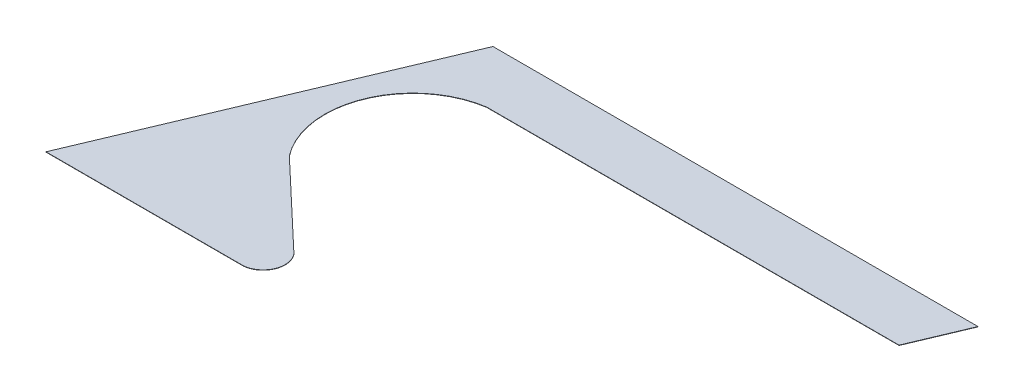
ISO-10303-21;
HEADER;
FILE_DESCRIPTION(('STEP AP214'),'2;1');
FILE_NAME('part.step','',(''),(''),'','','');
FILE_SCHEMA(('AUTOMOTIVE_DESIGN { 1 0 10303 214 1 1 1 1 }'));
ENDSEC;
DATA;
#1=APPLICATION_CONTEXT('core data for automotive mechanical design processes');
#2=APPLICATION_PROTOCOL_DEFINITION('international standard','automotive_design',2000,#1);
#3=PRODUCT_CONTEXT('',#1,'mechanical');
#4=PRODUCT('Part','Part','',(#3));
#5=PRODUCT_RELATED_PRODUCT_CATEGORY('part','',(#4));
#6=PRODUCT_DEFINITION_FORMATION('','',#4);
#7=PRODUCT_DEFINITION_CONTEXT('part definition',#1,'design');
#8=PRODUCT_DEFINITION('design','',#6,#7);
#9=PRODUCT_DEFINITION_SHAPE('','',#8);
#10=(LENGTH_UNIT() NAMED_UNIT(*) SI_UNIT(.MILLI.,.METRE.));
#11=(NAMED_UNIT(*) PLANE_ANGLE_UNIT() SI_UNIT($,.RADIAN.));
#12=(NAMED_UNIT(*) SI_UNIT($,.STERADIAN.) SOLID_ANGLE_UNIT());
#13=UNCERTAINTY_MEASURE_WITH_UNIT(LENGTH_MEASURE(1.E-05),#10,'distance_accuracy_value','');
#14=(GEOMETRIC_REPRESENTATION_CONTEXT(3) GLOBAL_UNCERTAINTY_ASSIGNED_CONTEXT((#13)) GLOBAL_UNIT_ASSIGNED_CONTEXT((#10,
#11,#12)) REPRESENTATION_CONTEXT('',''));
#15=CARTESIAN_POINT('',(0.,0.,0.));
#16=DIRECTION('',(0.,0.,1.));
#17=DIRECTION('',(1.,0.,0.));
#18=AXIS2_PLACEMENT_3D('',#15,#16,#17);
#19=CARTESIAN_POINT('',(2.42898250182353,1.4,-0.604428219022611));
#20=DIRECTION('',(0.,1.,0.));
#21=DIRECTION('',(0.,0.,1.));
#22=AXIS2_PLACEMENT_3D('',#19,#20,#21);
#23=PLANE('',#22);
#24=DIRECTION('',(1.,0.,0.));
#25=VECTOR('',#24,1.);
#26=CARTESIAN_POINT('',(2.22201824333883,1.4,-1.5656722541407));
#27=LINE('',#26,#25);
#28=CARTESIAN_POINT('',(2.22201824333883,1.4,-1.5656722541407));
#29=VERTEX_POINT('',#28);
#30=CARTESIAN_POINT('',(3.81387134230726,1.4,-1.5656722541407));
#31=VERTEX_POINT('',#30);
#32=EDGE_CURVE('E108',#29,#31,#27,.T.);
#33=ORIENTED_EDGE('',*,*,#32,.T.);
#34=DIRECTION('',(-0.38758863936305,0.,0.921832439566269));
#35=VECTOR('',#34,1.);
#36=CARTESIAN_POINT('',(3.81387134230726,1.4,-1.5656722541407));
#37=LINE('',#36,#35);
#38=CARTESIAN_POINT('',(3.73718050290381,1.4,-1.38327241988384));
#39=VERTEX_POINT('',#38);
#40=EDGE_CURVE('E113',#31,#39,#37,.T.);
#41=ORIENTED_EDGE('',*,*,#40,.T.);
#42=DIRECTION('',(-1.,0.,0.));
#43=VECTOR('',#42,1.);
#44=CARTESIAN_POINT('',(3.73718050290381,1.4,-1.38327241988384));
#45=LINE('',#44,#43);
#46=CARTESIAN_POINT('',(2.3836908237028,1.4,-1.38327241988385));
#47=VERTEX_POINT('',#46);
#48=EDGE_CURVE('E117',#39,#47,#45,.T.);
#49=ORIENTED_EDGE('',*,*,#48,.T.);
#50=CARTESIAN_POINT('',(2.42747650234616,1.4,-1.09742714252926));
#51=DIRECTION('',(0.,-1.,0.));
#52=DIRECTION('',(0.,0.,-1.));
#53=AXIS2_PLACEMENT_3D('',#50,#51,#52);
#54=CIRCLE('',#53,0.28917937035719);
#55=CARTESIAN_POINT('',(2.19848355236835,1.4,-0.920828906126266));
#56=VERTEX_POINT('',#55);
#57=EDGE_CURVE('E135',#47,#56,#54,.F.);
#58=ORIENTED_EDGE('',*,*,#57,.T.);
#59=DIRECTION('',(0.725985572382732,0.,0.687709930633633));
#60=VECTOR('',#59,1.);
#61=CARTESIAN_POINT('',(2.19848355236831,1.4,-0.920828906126307));
#62=LINE('',#61,#60);
#63=CARTESIAN_POINT('',(2.48512110337624,1.4,-0.649303551051155));
#64=VERTEX_POINT('',#63);
#65=EDGE_CURVE('E121',#56,#64,#62,.T.);
#66=ORIENTED_EDGE('',*,*,#65,.T.);
#67=CARTESIAN_POINT('',(2.42898250182353,1.4,-0.604428219022611));
#68=DIRECTION('',(0.,-1.,0.));
#69=DIRECTION('',(0.,0.,-1.));
#70=AXIS2_PLACEMENT_3D('',#67,#68,#69);
#71=CIRCLE('',#70,0.0718702859947409);
#72=CARTESIAN_POINT('',(2.43618709117142,1.4,-0.53291995445624));
#73=VERTEX_POINT('',#72);
#74=EDGE_CURVE('E90',#73,#64,#71,.F.);
#75=ORIENTED_EDGE('',*,*,#74,.F.);
#76=DIRECTION('',(-1.,0.,0.));
#77=VECTOR('',#76,1.);
#78=CARTESIAN_POINT('',(1.78779284460792,1.4,-0.532919954456243));
#79=LINE('',#78,#77);
#80=CARTESIAN_POINT('',(1.78779284460791,1.4,-0.532919954456245));
#81=VERTEX_POINT('',#80);
#82=EDGE_CURVE('E88',#73,#81,#79,.T.);
#83=ORIENTED_EDGE('',*,*,#82,.T.);
#84=DIRECTION('',(0.38758863936305,0.,-0.921832439566269));
#85=VECTOR('',#84,1.);
#86=CARTESIAN_POINT('',(2.22201824333883,1.4,-1.5656722541407));
#87=LINE('',#86,#85);
#88=EDGE_CURVE('E74',#81,#29,#87,.T.);
#89=ORIENTED_EDGE('',*,*,#88,.T.);
#90=EDGE_LOOP('',(#33,#41,#49,#58,#66,#75,#83,#89));
#91=FACE_BOUND('',#90,.T.);
#92=ADVANCED_FACE('F16',(#91),#23,.F.);
#93=CARTESIAN_POINT('',(2.22201824333883,1.401,-1.5656722541407));
#94=DIRECTION('',(0.921832439566269,0.,0.38758863936305));
#95=DIRECTION('',(0.38758863936305,0.,-0.921832439566269));
#96=AXIS2_PLACEMENT_3D('',#93,#94,#95);
#97=PLANE('',#96);
#98=DIRECTION('',(0.,1.,0.));
#99=VECTOR('',#98,1.);
#100=CARTESIAN_POINT('',(1.78779284460791,1.401,-0.532919954456246));
#101=LINE('',#100,#99);
#102=CARTESIAN_POINT('',(1.78779284460792,1.401,-0.532919954456244));
#103=VERTEX_POINT('',#102);
#104=EDGE_CURVE('E19',#81,#103,#101,.T.);
#105=ORIENTED_EDGE('',*,*,#104,.T.);
#106=DIRECTION('',(-0.387588639363042,0.,0.921832439566273));
#107=VECTOR('',#106,1.);
#108=CARTESIAN_POINT('',(2.22201824333883,1.401,-1.5656722541407));
#109=LINE('',#108,#107);
#110=CARTESIAN_POINT('',(2.22201824333883,1.401,-1.5656722541407));
#111=VERTEX_POINT('',#110);
#112=EDGE_CURVE('E104',#111,#103,#109,.T.);
#113=ORIENTED_EDGE('',*,*,#112,.F.);
#114=DIRECTION('',(0.,1.,0.));
#115=VECTOR('',#114,1.);
#116=CARTESIAN_POINT('',(2.22201824333883,1.401,-1.5656722541407));
#117=LINE('',#116,#115);
#118=EDGE_CURVE('E82',#111,#29,#117,.F.);
#119=ORIENTED_EDGE('',*,*,#118,.T.);
#120=ORIENTED_EDGE('',*,*,#88,.F.);
#121=EDGE_LOOP('',(#105,#113,#119,#120));
#122=FACE_BOUND('',#121,.T.);
#123=ADVANCED_FACE('F76',(#122),#97,.F.);
#124=CARTESIAN_POINT('',(1.78779284460792,1.401,-0.532919954456243));
#125=DIRECTION('',(0.,0.,-1.));
#126=DIRECTION('',(-1.,0.,0.));
#127=AXIS2_PLACEMENT_3D('',#124,#125,#126);
#128=PLANE('',#127);
#129=DIRECTION('',(0.,-1.,0.));
#130=VECTOR('',#129,1.);
#131=CARTESIAN_POINT('',(2.43618709117138,1.401,-0.532919954456236));
#132=LINE('',#131,#130);
#133=CARTESIAN_POINT('',(2.43618709117142,1.401,-0.53291995445624));
#134=VERTEX_POINT('',#133);
#135=EDGE_CURVE('E98',#134,#73,#132,.T.);
#136=ORIENTED_EDGE('',*,*,#135,.F.);
#137=DIRECTION('',(1.,0.,0.));
#138=VECTOR('',#137,1.);
#139=CARTESIAN_POINT('',(2.42898250182353,1.401,-0.532919954456243));
#140=LINE('',#139,#138);
#141=EDGE_CURVE('E96',#103,#134,#140,.T.);
#142=ORIENTED_EDGE('',*,*,#141,.F.);
#143=ORIENTED_EDGE('',*,*,#104,.F.);
#144=ORIENTED_EDGE('',*,*,#82,.F.);
#145=EDGE_LOOP('',(#136,#142,#143,#144));
#146=FACE_BOUND('',#145,.T.);
#147=ADVANCED_FACE('F94',(#146),#128,.F.);
#148=CARTESIAN_POINT('',(2.42898250182353,1.401,-0.604428219022611));
#149=DIRECTION('',(0.,-1.,0.));
#150=DIRECTION('',(0.,0.,-1.));
#151=AXIS2_PLACEMENT_3D('',#148,#149,#150);
#152=CYLINDRICAL_SURFACE('',#151,0.0718702859947409);
#153=CARTESIAN_POINT('',(2.42898250182353,1.401,-0.604428219022611));
#154=DIRECTION('',(0.,-1.,0.));
#155=DIRECTION('',(0.,0.,-1.));
#156=AXIS2_PLACEMENT_3D('',#153,#154,#155);
#157=CIRCLE('',#156,0.0718702859947409);
#158=CARTESIAN_POINT('',(2.48512110337624,1.401,-0.649303551051151));
#159=VERTEX_POINT('',#158);
#160=EDGE_CURVE('E103',#134,#159,#157,.F.);
#161=ORIENTED_EDGE('',*,*,#160,.F.);
#162=ORIENTED_EDGE('',*,*,#135,.T.);
#163=ORIENTED_EDGE('',*,*,#74,.T.);
#164=DIRECTION('',(0.,-1.,0.));
#165=VECTOR('',#164,1.);
#166=CARTESIAN_POINT('',(2.48512110337625,1.401,-0.649303551051143));
#167=LINE('',#166,#165);
#168=EDGE_CURVE('E123',#64,#159,#167,.F.);
#169=ORIENTED_EDGE('',*,*,#168,.T.);
#170=EDGE_LOOP('',(#161,#162,#163,#169));
#171=FACE_BOUND('',#170,.T.);
#172=ADVANCED_FACE('F141',(#171),#152,.T.);
#173=CARTESIAN_POINT('',(2.19848355236831,1.401,-0.920828906126307));
#174=DIRECTION('',(-0.687709930633633,0.,0.725985572382732));
#175=DIRECTION('',(0.725985572382732,0.,0.687709930633633));
#176=AXIS2_PLACEMENT_3D('',#173,#174,#175);
#177=PLANE('',#176);
#178=DIRECTION('',(0.,1.,0.));
#179=VECTOR('',#178,1.);
#180=CARTESIAN_POINT('',(2.19848355236831,1.401,-0.920828906126307));
#181=LINE('',#180,#179);
#182=CARTESIAN_POINT('',(2.19848355236832,1.401,-0.920828906126304));
#183=VERTEX_POINT('',#182);
#184=EDGE_CURVE('E122',#56,#183,#181,.T.);
#185=ORIENTED_EDGE('',*,*,#184,.T.);
#186=DIRECTION('',(-0.725985572382704,0.,-0.687709930633663));
#187=VECTOR('',#186,1.);
#188=CARTESIAN_POINT('',(2.48512110337625,1.401,-0.649303551051145));
#189=LINE('',#188,#187);
#190=EDGE_CURVE('E129',#159,#183,#189,.T.);
#191=ORIENTED_EDGE('',*,*,#190,.F.);
#192=ORIENTED_EDGE('',*,*,#168,.F.);
#193=ORIENTED_EDGE('',*,*,#65,.F.);
#194=EDGE_LOOP('',(#185,#191,#192,#193));
#195=FACE_BOUND('',#194,.T.);
#196=ADVANCED_FACE('F146',(#195),#177,.F.);
#197=CARTESIAN_POINT('',(2.42747650234616,1.401,-1.09742714252926));
#198=DIRECTION('',(0.,-1.,0.));
#199=DIRECTION('',(0.,0.,-1.));
#200=AXIS2_PLACEMENT_3D('',#197,#198,#199);
#201=CYLINDRICAL_SURFACE('',#200,0.28917937035719);
#202=DIRECTION('',(0.,-1.,0.));
#203=VECTOR('',#202,1.);
#204=CARTESIAN_POINT('',(2.38369082370284,1.401,-1.38327241988385));
#205=LINE('',#204,#203);
#206=CARTESIAN_POINT('',(2.38369082370279,1.401,-1.38327241988385));
#207=VERTEX_POINT('',#206);
#208=EDGE_CURVE('E120',#47,#207,#205,.F.);
#209=ORIENTED_EDGE('',*,*,#208,.T.);
#210=CARTESIAN_POINT('',(2.42747650234616,1.401,-1.09742714252926));
#211=DIRECTION('',(0.,-1.,0.));
#212=DIRECTION('',(0.,0.,-1.));
#213=AXIS2_PLACEMENT_3D('',#210,#211,#212);
#214=CIRCLE('',#213,0.28917937035719);
#215=EDGE_CURVE('E125',#183,#207,#214,.T.);
#216=ORIENTED_EDGE('',*,*,#215,.F.);
#217=ORIENTED_EDGE('',*,*,#184,.F.);
#218=ORIENTED_EDGE('',*,*,#57,.F.);
#219=EDGE_LOOP('',(#209,#216,#217,#218));
#220=FACE_BOUND('',#219,.T.);
#221=ADVANCED_FACE('F168',(#220),#201,.F.);
#222=CARTESIAN_POINT('',(3.73718050290381,1.401,-1.38327241988384));
#223=DIRECTION('',(0.,0.,-1.));
#224=DIRECTION('',(-1.,0.,0.));
#225=AXIS2_PLACEMENT_3D('',#222,#223,#224);
#226=PLANE('',#225);
#227=DIRECTION('',(0.,1.,0.));
#228=VECTOR('',#227,1.);
#229=CARTESIAN_POINT('',(3.73718050290381,1.401,-1.38327241988384));
#230=LINE('',#229,#228);
#231=CARTESIAN_POINT('',(3.73718050290381,1.401,-1.38327241988384));
#232=VERTEX_POINT('',#231);
#233=EDGE_CURVE('E116',#39,#232,#230,.T.);
#234=ORIENTED_EDGE('',*,*,#233,.T.);
#235=DIRECTION('',(1.,0.,0.));
#236=VECTOR('',#235,1.);
#237=CARTESIAN_POINT('',(2.42898250182353,1.401,-1.38327241988384));
#238=LINE('',#237,#236);
#239=EDGE_CURVE('E128',#207,#232,#238,.T.);
#240=ORIENTED_EDGE('',*,*,#239,.F.);
#241=ORIENTED_EDGE('',*,*,#208,.F.);
#242=ORIENTED_EDGE('',*,*,#48,.F.);
#243=EDGE_LOOP('',(#234,#240,#241,#242));
#244=FACE_BOUND('',#243,.T.);
#245=ADVANCED_FACE('F155',(#244),#226,.F.);
#246=CARTESIAN_POINT('',(3.81387134230726,1.401,-1.5656722541407));
#247=DIRECTION('',(-0.921832439566269,0.,-0.38758863936305));
#248=DIRECTION('',(-0.38758863936305,0.,0.921832439566269));
#249=AXIS2_PLACEMENT_3D('',#246,#247,#248);
#250=PLANE('',#249);
#251=DIRECTION('',(0.,1.,0.));
#252=VECTOR('',#251,1.);
#253=CARTESIAN_POINT('',(3.81387134230726,1.401,-1.5656722541407));
#254=LINE('',#253,#252);
#255=CARTESIAN_POINT('',(3.81387134230726,1.401,-1.5656722541407));
#256=VERTEX_POINT('',#255);
#257=EDGE_CURVE('E34',#31,#256,#254,.T.);
#258=ORIENTED_EDGE('',*,*,#257,.T.);
#259=DIRECTION('',(0.387588639363073,0.,-0.92183243956626));
#260=VECTOR('',#259,1.);
#261=CARTESIAN_POINT('',(3.73718050290381,1.401,-1.38327241988384));
#262=LINE('',#261,#260);
#263=EDGE_CURVE('E25',#232,#256,#262,.T.);
#264=ORIENTED_EDGE('',*,*,#263,.F.);
#265=ORIENTED_EDGE('',*,*,#233,.F.);
#266=ORIENTED_EDGE('',*,*,#40,.F.);
#267=EDGE_LOOP('',(#258,#264,#265,#266));
#268=FACE_BOUND('',#267,.T.);
#269=ADVANCED_FACE('F157',(#268),#250,.F.);
#270=CARTESIAN_POINT('',(2.22201824333883,1.401,-1.5656722541407));
#271=DIRECTION('',(0.,0.,1.));
#272=DIRECTION('',(1.,0.,0.));
#273=AXIS2_PLACEMENT_3D('',#270,#271,#272);
#274=PLANE('',#273);
#275=ORIENTED_EDGE('',*,*,#118,.F.);
#276=DIRECTION('',(1.,0.,0.));
#277=VECTOR('',#276,1.);
#278=CARTESIAN_POINT('',(2.42898250182353,1.401,-1.5656722541407));
#279=LINE('',#278,#277);
#280=EDGE_CURVE('E11',#256,#111,#279,.F.);
#281=ORIENTED_EDGE('',*,*,#280,.F.);
#282=ORIENTED_EDGE('',*,*,#257,.F.);
#283=ORIENTED_EDGE('',*,*,#32,.F.);
#284=EDGE_LOOP('',(#275,#281,#282,#283));
#285=FACE_BOUND('',#284,.T.);
#286=ADVANCED_FACE('F159',(#285),#274,.F.);
#287=CARTESIAN_POINT('',(2.42898250182353,1.401,-0.604428219022611));
#288=DIRECTION('',(0.,1.,0.));
#289=DIRECTION('',(0.,0.,1.));
#290=AXIS2_PLACEMENT_3D('',#287,#288,#289);
#291=PLANE('',#290);
#292=ORIENTED_EDGE('',*,*,#263,.T.);
#293=ORIENTED_EDGE('',*,*,#280,.T.);
#294=ORIENTED_EDGE('',*,*,#112,.T.);
#295=ORIENTED_EDGE('',*,*,#141,.T.);
#296=ORIENTED_EDGE('',*,*,#160,.T.);
#297=ORIENTED_EDGE('',*,*,#190,.T.);
#298=ORIENTED_EDGE('',*,*,#215,.T.);
#299=ORIENTED_EDGE('',*,*,#239,.T.);
#300=EDGE_LOOP('',(#292,#293,#294,#295,#296,#297,#298,#299));
#301=FACE_BOUND('',#300,.T.);
#302=ADVANCED_FACE('F107',(#301),#291,.T.);
#303=CLOSED_SHELL('',(#92,#123,#147,#172,#196,#221,#245,#269,#286,#302));
#304=MANIFOLD_SOLID_BREP('B1',#303);
#305=ADVANCED_BREP_SHAPE_REPRESENTATION('',(#18,#304),#14);
#306=SHAPE_DEFINITION_REPRESENTATION(#9,#305);
ENDSEC;
END-ISO-10303-21;
